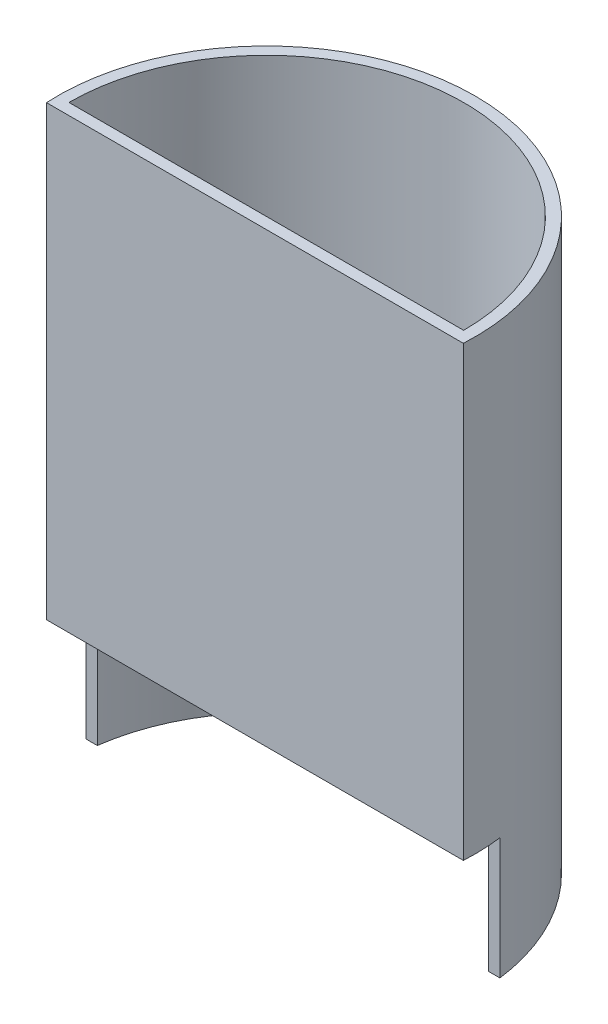
ISO-10303-21;
HEADER;
FILE_DESCRIPTION(('STEP AP214'),'2;1');
FILE_NAME('part.step','',(''),(''),'','','');
FILE_SCHEMA(('AUTOMOTIVE_DESIGN { 1 0 10303 214 1 1 1 1 }'));
ENDSEC;
DATA;
#1=APPLICATION_CONTEXT('core data for automotive mechanical design processes');
#2=APPLICATION_PROTOCOL_DEFINITION('international standard','automotive_design',2000,#1);
#3=PRODUCT_CONTEXT('',#1,'mechanical');
#4=PRODUCT('Part','Part','',(#3));
#5=PRODUCT_RELATED_PRODUCT_CATEGORY('part','',(#4));
#6=PRODUCT_DEFINITION_FORMATION('','',#4);
#7=PRODUCT_DEFINITION_CONTEXT('part definition',#1,'design');
#8=PRODUCT_DEFINITION('design','',#6,#7);
#9=PRODUCT_DEFINITION_SHAPE('','',#8);
#10=(LENGTH_UNIT() NAMED_UNIT(*) SI_UNIT(.MILLI.,.METRE.));
#11=(NAMED_UNIT(*) PLANE_ANGLE_UNIT() SI_UNIT($,.RADIAN.));
#12=(NAMED_UNIT(*) SI_UNIT($,.STERADIAN.) SOLID_ANGLE_UNIT());
#13=UNCERTAINTY_MEASURE_WITH_UNIT(LENGTH_MEASURE(1.E-05),#10,'distance_accuracy_value','');
#14=(GEOMETRIC_REPRESENTATION_CONTEXT(3) GLOBAL_UNCERTAINTY_ASSIGNED_CONTEXT((#13)) GLOBAL_UNIT_ASSIGNED_CONTEXT((#10,
#11,#12)) REPRESENTATION_CONTEXT('',''));
#15=CARTESIAN_POINT('',(0.,0.,0.));
#16=DIRECTION('',(0.,0.,1.));
#17=DIRECTION('',(1.,0.,0.));
#18=AXIS2_PLACEMENT_3D('',#15,#16,#17);
#19=CARTESIAN_POINT('',(0.,150.,0.));
#20=DIRECTION('',(0.,-1.,0.));
#21=DIRECTION('',(0.,0.,-1.));
#22=AXIS2_PLACEMENT_3D('',#19,#20,#21);
#23=CYLINDRICAL_SURFACE('',#22,52.);
#24=DIRECTION('',(0.,-1.,0.));
#25=VECTOR('',#24,1.);
#26=CARTESIAN_POINT('',(-52.,150.,0.));
#27=LINE('',#26,#25);
#28=CARTESIAN_POINT('',(-52.,150.,0.));
#29=VERTEX_POINT('',#28);
#30=CARTESIAN_POINT('',(-52.,123.210235533031,0.));
#31=VERTEX_POINT('',#30);
#32=EDGE_CURVE('E184',#29,#31,#27,.T.);
#33=ORIENTED_EDGE('',*,*,#32,.T.);
#34=CARTESIAN_POINT('',(0.,47.,0.));
#35=DIRECTION('',(0.732790726279141,0.499999999999998,-0.461538461538462));
#36=DIRECTION('',(0.423076923076922,-0.86602540378444,-0.266469355010596));
#37=AXIS2_PLACEMENT_3D('',#34,#35,#36);
#38=ELLIPSE('',#37,104.,52.);
#39=CARTESIAN_POINT('',(-27.712812921102,47.,-44.));
#40=VERTEX_POINT('',#39);
#41=EDGE_CURVE('E43',#31,#40,#38,.F.);
#42=ORIENTED_EDGE('',*,*,#41,.T.);
#43=DIRECTION('',(0.,-1.,0.));
#44=VECTOR('',#43,1.);
#45=CARTESIAN_POINT('',(-27.712812921102,47.,-44.));
#46=LINE('',#45,#44);
#47=CARTESIAN_POINT('',(-27.712812921102,32.,-44.));
#48=VERTEX_POINT('',#47);
#49=EDGE_CURVE('E138',#40,#48,#46,.T.);
#50=ORIENTED_EDGE('',*,*,#49,.T.);
#51=CARTESIAN_POINT('',(0.,32.,0.));
#52=DIRECTION('',(0.,-1.,0.));
#53=DIRECTION('',(0.,0.,-1.));
#54=AXIS2_PLACEMENT_3D('',#51,#52,#53);
#55=CIRCLE('',#54,52.);
#56=CARTESIAN_POINT('',(-51.526692111953,32.,-7.));
#57=VERTEX_POINT('',#56);
#58=EDGE_CURVE('E119',#57,#48,#55,.T.);
#59=ORIENTED_EDGE('',*,*,#58,.F.);
#60=DIRECTION('',(0.,-1.,0.));
#61=VECTOR('',#60,1.);
#62=CARTESIAN_POINT('',(-51.526692111953,150.,-7.));
#63=LINE('',#62,#61);
#64=CARTESIAN_POINT('',(-51.526692111953,0.,-7.));
#65=VERTEX_POINT('',#64);
#66=EDGE_CURVE('E129',#57,#65,#63,.T.);
#67=ORIENTED_EDGE('',*,*,#66,.T.);
#68=CARTESIAN_POINT('',(0.,0.,0.));
#69=DIRECTION('',(0.,1.,0.));
#70=DIRECTION('',(0.,0.,1.));
#71=AXIS2_PLACEMENT_3D('',#68,#69,#70);
#72=CIRCLE('',#71,52.);
#73=CARTESIAN_POINT('',(51.526692111953,0.,-7.));
#74=VERTEX_POINT('',#73);
#75=EDGE_CURVE('E170',#74,#65,#72,.T.);
#76=ORIENTED_EDGE('',*,*,#75,.F.);
#77=DIRECTION('',(0.,-1.,0.));
#78=VECTOR('',#77,1.);
#79=CARTESIAN_POINT('',(51.526692111953,150.,-7.));
#80=LINE('',#79,#78);
#81=CARTESIAN_POINT('',(51.526692111953,32.,-7.));
#82=VERTEX_POINT('',#81);
#83=EDGE_CURVE('E136',#74,#82,#80,.F.);
#84=ORIENTED_EDGE('',*,*,#83,.T.);
#85=CARTESIAN_POINT('',(0.,32.,0.));
#86=DIRECTION('',(0.,-1.,0.));
#87=DIRECTION('',(0.,0.,-1.));
#88=AXIS2_PLACEMENT_3D('',#85,#86,#87);
#89=CIRCLE('',#88,52.);
#90=CARTESIAN_POINT('',(52.,32.,0.));
#91=VERTEX_POINT('',#90);
#92=EDGE_CURVE('E166',#82,#91,#89,.T.);
#93=ORIENTED_EDGE('',*,*,#92,.T.);
#94=DIRECTION('',(0.,-1.,0.));
#95=VECTOR('',#94,1.);
#96=CARTESIAN_POINT('',(52.,150.,0.));
#97=LINE('',#96,#95);
#98=CARTESIAN_POINT('',(52.,150.,0.));
#99=VERTEX_POINT('',#98);
#100=EDGE_CURVE('E178',#99,#91,#97,.T.);
#101=ORIENTED_EDGE('',*,*,#100,.F.);
#102=CARTESIAN_POINT('',(0.,150.,0.));
#103=DIRECTION('',(0.,1.,0.));
#104=DIRECTION('',(0.,0.,1.));
#105=AXIS2_PLACEMENT_3D('',#102,#103,#104);
#106=CIRCLE('',#105,52.);
#107=EDGE_CURVE('E171',#99,#29,#106,.T.);
#108=ORIENTED_EDGE('',*,*,#107,.T.);
#109=EDGE_LOOP('',(#33,#42,#50,#59,#67,#76,#84,#93,#101,#108));
#110=FACE_BOUND('',#109,.T.);
#111=ADVANCED_FACE('F39',(#110),#23,.F.);
#112=CARTESIAN_POINT('',(0.,0.,0.));
#113=DIRECTION('',(0.,1.,0.));
#114=DIRECTION('',(0.,0.,1.));
#115=AXIS2_PLACEMENT_3D('',#112,#113,#114);
#116=PLANE('',#115);
#117=DIRECTION('',(1.,0.,0.));
#118=VECTOR('',#117,1.);
#119=CARTESIAN_POINT('',(-64.723211537616,0.,-7.));
#120=LINE('',#119,#118);
#121=CARTESIAN_POINT('',(-54.5527267879434,0.,-7.));
#122=VERTEX_POINT('',#121);
#123=EDGE_CURVE('E126',#122,#65,#120,.T.);
#124=ORIENTED_EDGE('',*,*,#123,.F.);
#125=CARTESIAN_POINT('',(0.,0.,0.));
#126=DIRECTION('',(0.,1.,0.));
#127=DIRECTION('',(0.,0.,1.));
#128=AXIS2_PLACEMENT_3D('',#125,#126,#127);
#129=CIRCLE('',#128,55.);
#130=CARTESIAN_POINT('',(54.5527267879434,0.,-7.));
#131=VERTEX_POINT('',#130);
#132=EDGE_CURVE('E187',#131,#122,#129,.T.);
#133=ORIENTED_EDGE('',*,*,#132,.F.);
#134=EDGE_CURVE('E152',#74,#131,#120,.T.);
#135=ORIENTED_EDGE('',*,*,#134,.F.);
#136=ORIENTED_EDGE('',*,*,#75,.T.);
#137=EDGE_LOOP('',(#124,#133,#135,#136));
#138=FACE_BOUND('',#137,.T.);
#139=ADVANCED_FACE('F228',(#138),#116,.F.);
#140=CARTESIAN_POINT('',(-54.9181208709839,150.,3.));
#141=DIRECTION('',(0.,0.,-1.));
#142=DIRECTION('',(-1.,0.,0.));
#143=AXIS2_PLACEMENT_3D('',#140,#141,#142);
#144=PLANE('',#143);
#145=DIRECTION('',(1.,0.,0.));
#146=VECTOR('',#145,1.);
#147=CARTESIAN_POINT('',(-54.9181208709839,32.,3.));
#148=LINE('',#147,#146);
#149=CARTESIAN_POINT('',(-54.9181208709839,32.,3.));
#150=VERTEX_POINT('',#149);
#151=CARTESIAN_POINT('',(54.9181208709839,32.,3.));
#152=VERTEX_POINT('',#151);
#153=EDGE_CURVE('E135',#150,#152,#148,.T.);
#154=ORIENTED_EDGE('',*,*,#153,.T.);
#155=DIRECTION('',(0.,-1.,0.));
#156=VECTOR('',#155,1.);
#157=CARTESIAN_POINT('',(54.9181208709839,150.,3.));
#158=LINE('',#157,#156);
#159=CARTESIAN_POINT('',(54.9181208709839,150.,3.));
#160=VERTEX_POINT('',#159);
#161=EDGE_CURVE('E195',#160,#152,#158,.T.);
#162=ORIENTED_EDGE('',*,*,#161,.F.);
#163=DIRECTION('',(1.,0.,0.));
#164=VECTOR('',#163,1.);
#165=CARTESIAN_POINT('',(-54.9181208709839,150.,3.));
#166=LINE('',#165,#164);
#167=CARTESIAN_POINT('',(-54.9181208709839,150.,3.));
#168=VERTEX_POINT('',#167);
#169=EDGE_CURVE('E192',#168,#160,#166,.T.);
#170=ORIENTED_EDGE('',*,*,#169,.F.);
#171=DIRECTION('',(0.,-1.,0.));
#172=VECTOR('',#171,1.);
#173=CARTESIAN_POINT('',(-54.9181208709839,150.,3.));
#174=LINE('',#173,#172);
#175=EDGE_CURVE('E202',#168,#150,#174,.T.);
#176=ORIENTED_EDGE('',*,*,#175,.T.);
#177=EDGE_LOOP('',(#154,#162,#170,#176));
#178=FACE_BOUND('',#177,.T.);
#179=ADVANCED_FACE('F233',(#178),#144,.F.);
#180=CARTESIAN_POINT('',(-52.,150.,0.));
#181=DIRECTION('',(0.,0.,-1.));
#182=DIRECTION('',(-1.,0.,0.));
#183=AXIS2_PLACEMENT_3D('',#180,#181,#182);
#184=PLANE('',#183);
#185=DIRECTION('',(0.,-1.,0.));
#186=VECTOR('',#185,1.);
#187=CARTESIAN_POINT('',(0.,47.,0.));
#188=LINE('',#187,#186);
#189=CARTESIAN_POINT('',(0.,47.,0.));
#190=VERTEX_POINT('',#189);
#191=CARTESIAN_POINT('',(0.,32.,0.));
#192=VERTEX_POINT('',#191);
#193=EDGE_CURVE('E148',#190,#192,#188,.T.);
#194=ORIENTED_EDGE('',*,*,#193,.F.);
#195=DIRECTION('',(0.563621480190676,-0.826033187630903,0.));
#196=VECTOR('',#195,1.);
#197=CARTESIAN_POINT('',(-64.4725119260938,141.489717678726,0.));
#198=LINE('',#197,#196);
#199=EDGE_CURVE('E143',#190,#31,#198,.F.);
#200=ORIENTED_EDGE('',*,*,#199,.T.);
#201=ORIENTED_EDGE('',*,*,#32,.F.);
#202=DIRECTION('',(1.,0.,0.));
#203=VECTOR('',#202,1.);
#204=CARTESIAN_POINT('',(-52.,150.,0.));
#205=LINE('',#204,#203);
#206=EDGE_CURVE('E175',#29,#99,#205,.T.);
#207=ORIENTED_EDGE('',*,*,#206,.T.);
#208=ORIENTED_EDGE('',*,*,#100,.T.);
#209=DIRECTION('',(-1.,0.,0.));
#210=VECTOR('',#209,1.);
#211=CARTESIAN_POINT('',(-52.,32.,0.));
#212=LINE('',#211,#210);
#213=EDGE_CURVE('E206',#91,#192,#212,.T.);
#214=ORIENTED_EDGE('',*,*,#213,.T.);
#215=EDGE_LOOP('',(#194,#200,#201,#207,#208,#214));
#216=FACE_BOUND('',#215,.T.);
#217=ADVANCED_FACE('F238',(#216),#184,.T.);
#218=CARTESIAN_POINT('',(0.,150.,0.));
#219=DIRECTION('',(0.,1.,0.));
#220=DIRECTION('',(0.,0.,1.));
#221=AXIS2_PLACEMENT_3D('',#218,#219,#220);
#222=PLANE('',#221);
#223=CARTESIAN_POINT('',(0.,150.,0.));
#224=DIRECTION('',(0.,1.,0.));
#225=DIRECTION('',(0.,0.,1.));
#226=AXIS2_PLACEMENT_3D('',#223,#224,#225);
#227=CIRCLE('',#226,55.);
#228=EDGE_CURVE('E188',#160,#168,#227,.T.);
#229=ORIENTED_EDGE('',*,*,#228,.T.);
#230=ORIENTED_EDGE('',*,*,#169,.T.);
#231=EDGE_LOOP('',(#229,#230));
#232=FACE_BOUND('',#231,.T.);
#233=ORIENTED_EDGE('',*,*,#206,.F.);
#234=ORIENTED_EDGE('',*,*,#107,.F.);
#235=EDGE_LOOP('',(#233,#234));
#236=FACE_BOUND('',#235,.T.);
#237=ADVANCED_FACE('F240',(#232,#236),#222,.T.);
#238=CARTESIAN_POINT('',(0.,150.,0.));
#239=DIRECTION('',(0.,-1.,0.));
#240=DIRECTION('',(0.,0.,-1.));
#241=AXIS2_PLACEMENT_3D('',#238,#239,#240);
#242=CYLINDRICAL_SURFACE('',#241,55.);
#243=DIRECTION('',(0.,-1.,0.));
#244=VECTOR('',#243,1.);
#245=CARTESIAN_POINT('',(-54.5527267879434,150.,-7.));
#246=LINE('',#245,#244);
#247=CARTESIAN_POINT('',(-54.5527267879434,32.,-7.));
#248=VERTEX_POINT('',#247);
#249=EDGE_CURVE('E11',#248,#122,#246,.T.);
#250=ORIENTED_EDGE('',*,*,#249,.F.);
#251=CARTESIAN_POINT('',(0.,32.,0.));
#252=DIRECTION('',(0.,1.,0.));
#253=DIRECTION('',(0.,0.,1.));
#254=AXIS2_PLACEMENT_3D('',#251,#252,#253);
#255=CIRCLE('',#254,55.);
#256=EDGE_CURVE('E121',#248,#150,#255,.T.);
#257=ORIENTED_EDGE('',*,*,#256,.T.);
#258=ORIENTED_EDGE('',*,*,#175,.F.);
#259=ORIENTED_EDGE('',*,*,#228,.F.);
#260=ORIENTED_EDGE('',*,*,#161,.T.);
#261=CARTESIAN_POINT('',(54.5527267879434,32.,-7.));
#262=VERTEX_POINT('',#261);
#263=EDGE_CURVE('E159',#152,#262,#255,.T.);
#264=ORIENTED_EDGE('',*,*,#263,.T.);
#265=DIRECTION('',(0.,-1.,0.));
#266=VECTOR('',#265,1.);
#267=CARTESIAN_POINT('',(54.5527267879434,150.,-7.));
#268=LINE('',#267,#266);
#269=EDGE_CURVE('E50',#131,#262,#268,.F.);
#270=ORIENTED_EDGE('',*,*,#269,.F.);
#271=ORIENTED_EDGE('',*,*,#132,.T.);
#272=EDGE_LOOP('',(#250,#257,#258,#259,#260,#264,#270,#271));
#273=FACE_BOUND('',#272,.T.);
#274=ADVANCED_FACE('F242',(#273),#242,.T.);
#275=CARTESIAN_POINT('',(-54.9181208709839,32.,-2.));
#276=DIRECTION('',(0.,-1.,0.));
#277=DIRECTION('',(0.,0.,-1.));
#278=AXIS2_PLACEMENT_3D('',#275,#276,#277);
#279=PLANE('',#278);
#280=ORIENTED_EDGE('',*,*,#153,.F.);
#281=ORIENTED_EDGE('',*,*,#256,.F.);
#282=DIRECTION('',(-1.,0.,0.));
#283=VECTOR('',#282,1.);
#284=CARTESIAN_POINT('',(62.1101626246066,32.,-7.));
#285=LINE('',#284,#283);
#286=EDGE_CURVE('E113',#57,#248,#285,.T.);
#287=ORIENTED_EDGE('',*,*,#286,.F.);
#288=ORIENTED_EDGE('',*,*,#58,.T.);
#289=DIRECTION('',(0.532938710021193,0.,0.846153846153846));
#290=VECTOR('',#289,1.);
#291=CARTESIAN_POINT('',(-27.712812921102,32.,-44.));
#292=LINE('',#291,#290);
#293=EDGE_CURVE('E140',#48,#192,#292,.T.);
#294=ORIENTED_EDGE('',*,*,#293,.T.);
#295=ORIENTED_EDGE('',*,*,#213,.F.);
#296=ORIENTED_EDGE('',*,*,#92,.F.);
#297=EDGE_CURVE('E125',#262,#82,#285,.T.);
#298=ORIENTED_EDGE('',*,*,#297,.F.);
#299=ORIENTED_EDGE('',*,*,#263,.F.);
#300=EDGE_LOOP('',(#280,#281,#287,#288,#294,#295,#296,#298,#299));
#301=FACE_BOUND('',#300,.T.);
#302=ADVANCED_FACE('F116',(#301),#279,.T.);
#303=CARTESIAN_POINT('',(0.,0.,-7.));
#304=DIRECTION('',(0.,0.,1.));
#305=DIRECTION('',(1.,0.,0.));
#306=AXIS2_PLACEMENT_3D('',#303,#304,#305);
#307=PLANE('',#306);
#308=ORIENTED_EDGE('',*,*,#286,.T.);
#309=ORIENTED_EDGE('',*,*,#249,.T.);
#310=ORIENTED_EDGE('',*,*,#123,.T.);
#311=ORIENTED_EDGE('',*,*,#66,.F.);
#312=EDGE_LOOP('',(#308,#309,#310,#311));
#313=FACE_BOUND('',#312,.T.);
#314=ADVANCED_FACE('F130',(#313),#307,.T.);
#315=ORIENTED_EDGE('',*,*,#134,.T.);
#316=ORIENTED_EDGE('',*,*,#269,.T.);
#317=ORIENTED_EDGE('',*,*,#297,.T.);
#318=ORIENTED_EDGE('',*,*,#83,.F.);
#319=EDGE_LOOP('',(#315,#316,#317,#318));
#320=FACE_BOUND('',#319,.T.);
#321=ADVANCED_FACE('F225',(#320),#307,.T.);
#322=CARTESIAN_POINT('',(-27.712812921102,47.,-44.));
#323=DIRECTION('',(0.846153846153846,0.,-0.532938710021193));
#324=DIRECTION('',(-0.532938710021193,0.,-0.846153846153846));
#325=AXIS2_PLACEMENT_3D('',#322,#323,#324);
#326=PLANE('',#325);
#327=ORIENTED_EDGE('',*,*,#293,.F.);
#328=ORIENTED_EDGE('',*,*,#49,.F.);
#329=DIRECTION('',(0.532938710021193,0.,0.846153846153846));
#330=VECTOR('',#329,1.);
#331=CARTESIAN_POINT('',(-27.712812921102,47.,-44.));
#332=LINE('',#331,#330);
#333=EDGE_CURVE('E146',#40,#190,#332,.T.);
#334=ORIENTED_EDGE('',*,*,#333,.T.);
#335=ORIENTED_EDGE('',*,*,#193,.T.);
#336=EDGE_LOOP('',(#327,#328,#334,#335));
#337=FACE_BOUND('',#336,.T.);
#338=ADVANCED_FACE('F219',(#337),#326,.T.);
#339=CARTESIAN_POINT('',(-27.712812921102,47.,-44.));
#340=DIRECTION('',(0.732790726279141,0.499999999999998,-0.461538461538462));
#341=DIRECTION('',(-0.563621480190676,0.826033187630903,0.));
#342=AXIS2_PLACEMENT_3D('',#339,#340,#341);
#343=PLANE('',#342);
#344=ORIENTED_EDGE('',*,*,#199,.F.);
#345=ORIENTED_EDGE('',*,*,#333,.F.);
#346=ORIENTED_EDGE('',*,*,#41,.F.);
#347=EDGE_LOOP('',(#344,#345,#346));
#348=FACE_BOUND('',#347,.T.);
#349=ADVANCED_FACE('F41',(#348),#343,.T.);
#350=CLOSED_SHELL('',(#111,#139,#179,#217,#237,#274,#302,#314,#321,#338,#349));
#351=MANIFOLD_SOLID_BREP('B2',#350);
#352=ADVANCED_BREP_SHAPE_REPRESENTATION('',(#18,#351),#14);
#353=SHAPE_DEFINITION_REPRESENTATION(#9,#352);
ENDSEC;
END-ISO-10303-21;
